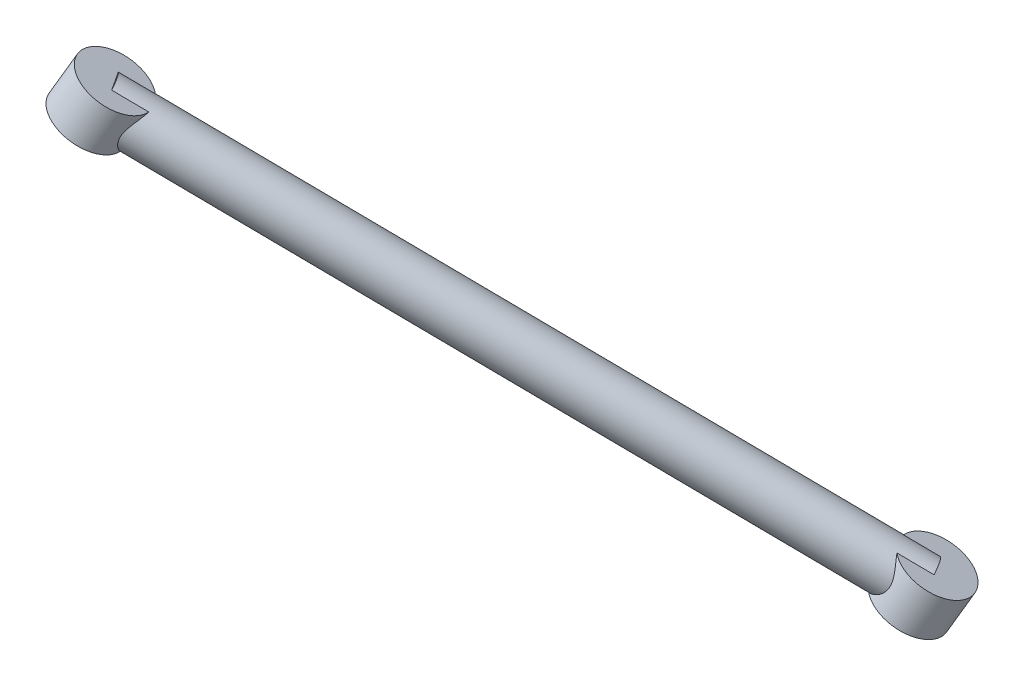
ISO-10303-21;
HEADER;
FILE_DESCRIPTION(('STEP AP214'),'2;1');
FILE_NAME('part.step','',(''),(''),'','','');
FILE_SCHEMA(('AUTOMOTIVE_DESIGN { 1 0 10303 214 1 1 1 1 }'));
ENDSEC;
DATA;
#1=APPLICATION_CONTEXT('core data for automotive mechanical design processes');
#2=APPLICATION_PROTOCOL_DEFINITION('international standard','automotive_design',2000,#1);
#3=PRODUCT_CONTEXT('',#1,'mechanical');
#4=PRODUCT('Part','Part','',(#3));
#5=PRODUCT_RELATED_PRODUCT_CATEGORY('part','',(#4));
#6=PRODUCT_DEFINITION_FORMATION('','',#4);
#7=PRODUCT_DEFINITION_CONTEXT('part definition',#1,'design');
#8=PRODUCT_DEFINITION('design','',#6,#7);
#9=PRODUCT_DEFINITION_SHAPE('','',#8);
#10=(LENGTH_UNIT() NAMED_UNIT(*) SI_UNIT(.MILLI.,.METRE.));
#11=(NAMED_UNIT(*) PLANE_ANGLE_UNIT() SI_UNIT($,.RADIAN.));
#12=(NAMED_UNIT(*) SI_UNIT($,.STERADIAN.) SOLID_ANGLE_UNIT());
#13=UNCERTAINTY_MEASURE_WITH_UNIT(LENGTH_MEASURE(1.E-05),#10,'distance_accuracy_value','');
#14=(GEOMETRIC_REPRESENTATION_CONTEXT(3) GLOBAL_UNCERTAINTY_ASSIGNED_CONTEXT((#13)) GLOBAL_UNIT_ASSIGNED_CONTEXT((#10,
#11,#12)) REPRESENTATION_CONTEXT('',''));
#15=CARTESIAN_POINT('',(0.,0.,0.));
#16=DIRECTION('',(0.,0.,1.));
#17=DIRECTION('',(1.,0.,0.));
#18=AXIS2_PLACEMENT_3D('',#15,#16,#17);
#19=CARTESIAN_POINT('',(510.46,-91.3399999999999,-282.35));
#20=DIRECTION('',(-0.73343010732889,0.486905775206921,0.474344857391413));
#21=DIRECTION('',(-0.553088880485254,-0.833122254104143,0.));
#22=AXIS2_PLACEMENT_3D('',#19,#20,#21);
#23=CYLINDRICAL_SURFACE('',#22,8.00000000000003);
#24=CARTESIAN_POINT('',(497.979704526284,-92.4944425144162,-278.757022363282));
#25=CARTESIAN_POINT('',(497.9686401532,-92.4339060738786,-279.003958226111));
#26=CARTESIAN_POINT('',(497.96842527591,-92.368060822191,-279.249942689364));
#27=CARTESIAN_POINT('',(497.987851661969,-92.2258509673458,-279.737849666615));
#28=CARTESIAN_POINT('',(498.007476064368,-92.1494953443142,-279.979775452496));
#29=CARTESIAN_POINT('',(498.064818196751,-91.9859960781895,-280.458605063477));
#30=CARTESIAN_POINT('',(498.102594244374,-91.8988183400298,-280.695490113989));
#31=CARTESIAN_POINT('',(498.19438365573,-91.7135536500882,-281.161776547205));
#32=CARTESIAN_POINT('',(498.248400627116,-91.6154642775198,-281.391176254599));
#33=CARTESIAN_POINT('',(498.370616234162,-91.4080865997483,-281.840132202242));
#34=CARTESIAN_POINT('',(498.43877496764,-91.298830234059,-282.059714069746));
#35=CARTESIAN_POINT('',(498.587475996494,-91.0679629503808,-282.487951370339));
#36=CARTESIAN_POINT('',(498.668019281134,-90.9463510457076,-282.696605928778));
#37=CARTESIAN_POINT('',(498.839389723408,-90.6896931945735,-283.100615250758));
#38=CARTESIAN_POINT('',(498.930201429063,-90.5546674695319,-283.295989307752));
#39=CARTESIAN_POINT('',(499.119954523892,-90.2696696627253,-283.671080884745));
#40=CARTESIAN_POINT('',(499.218892100208,-90.1197045839182,-283.850805667128));
#41=CARTESIAN_POINT('',(499.459289594562,-89.7459081346898,-284.253073352077));
#42=CARTESIAN_POINT('',(499.603236954973,-89.5149183431614,-284.467743600787));
#43=CARTESIAN_POINT('',(499.821252164908,-89.144005256336,-284.755884073674));
#44=CARTESIAN_POINT('',(499.894235404857,-89.0163670395075,-284.846249507383));
#45=CARTESIAN_POINT('',(500.039932885416,-88.7529982427993,-285.014487029));
#46=CARTESIAN_POINT('',(500.112647244156,-88.6172718199945,-285.092365460139));
#47=CARTESIAN_POINT('',(500.257440631761,-88.3369970303165,-285.23505006606));
#48=CARTESIAN_POINT('',(500.329508906747,-88.1923831362872,-285.299738732355));
#49=CARTESIAN_POINT('',(500.471470525285,-87.8963568495955,-285.414261462306));
#50=CARTESIAN_POINT('',(500.541363912925,-87.7449445948956,-285.464095827251));
#51=CARTESIAN_POINT('',(500.678338313978,-87.4366180268196,-285.548435523254));
#52=CARTESIAN_POINT('',(500.74541834873,-87.2797018331177,-285.582935559472));
#53=CARTESIAN_POINT('',(500.876405475152,-86.9619894698657,-285.636614553055));
#54=CARTESIAN_POINT('',(500.94031253945,-86.8011932668627,-285.655793378275));
#55=CARTESIAN_POINT('',(501.058760131645,-86.4934350354106,-285.678160182097));
#56=CARTESIAN_POINT('',(501.113600323982,-86.3466863127509,-285.682747954535));
#57=CARTESIAN_POINT('',(501.220932322712,-86.0523990932229,-285.680507337097));
#58=CARTESIAN_POINT('',(501.273423276173,-85.9048603309376,-285.673674834859));
#59=CARTESIAN_POINT('',(501.42792657737,-85.4623646899532,-285.637076461534));
#60=CARTESIAN_POINT('',(501.526946696968,-85.1675888127945,-285.591205938089));
#61=CARTESIAN_POINT('',(501.69988312355,-84.6469164414158,-285.476200309172));
#62=CARTESIAN_POINT('',(501.774670602433,-84.4196675074609,-285.414060104468));
#63=CARTESIAN_POINT('',(501.923398302998,-83.9713463500511,-285.269364641217));
#64=CARTESIAN_POINT('',(501.997338125305,-83.7502769728136,-285.186800142509));
#65=CARTESIAN_POINT('',(502.146183749991,-83.3158805107332,-285.003226099497));
#66=CARTESIAN_POINT('',(502.221090857817,-83.102565795724,-284.902188513233));
#67=CARTESIAN_POINT('',(502.373335161067,-82.6856063790795,-284.683433896029));
#68=CARTESIAN_POINT('',(502.450672127916,-82.4819607723746,-284.565718430335));
#69=CARTESIAN_POINT('',(502.607657105387,-82.0896385092538,-284.317320022102));
#70=CARTESIAN_POINT('',(502.687233931976,-81.9007518511049,-284.186923813876));
#71=CARTESIAN_POINT('',(502.85114303619,-81.5354141974547,-283.912483659537));
#72=CARTESIAN_POINT('',(502.935474304785,-81.3589605810579,-283.768442604868));
#73=CARTESIAN_POINT('',(503.109624433282,-81.020609669561,-283.46806691869));
#74=CARTESIAN_POINT('',(503.199429031101,-80.8586770493904,-283.311763956692));
#75=CARTESIAN_POINT('',(503.38545153918,-80.5507029313751,-282.987486684167));
#76=CARTESIAN_POINT('',(503.481674394108,-80.404673919198,-282.819503370695));
#77=CARTESIAN_POINT('',(503.581405175729,-80.2676399121447,-282.646270580201));
#78=B_SPLINE_CURVE_WITH_KNOTS('',3,(#24,#25,#26,#27,#28,#29,#30,#31,#32,#33,#34,#35,#36,#37,#38,
#39,#40,#41,#42,#43,#44,#45,#46,#47,#48,#49,#50,#51,#52,#53,#54,#55,#56,#57,#58,#59,#60,#61,#62,
#63,#64,#65,#66,#67,#68,#69,#70,#71,#72,#73,#74,#75,#76,#77),.UNSPECIFIED.,.F.,.F.,(4,2,2,2,2,2,
2,2,2,2,2,2,2,2,2,2,2,2,2,2,2,2,2,2,2,2,4),(0.,0.762988254942127,1.5253286083267,
2.29013475509866,3.05511091661943,3.81795729148071,4.58086463341728,5.34263885412003,
6.10405765165901,7.13954188038951,7.65675990399524,8.17371434952882,8.69509046337565,
9.21645600145778,9.73800142393714,10.2595513447312,10.7292678807946,11.1991535950392,
12.139117010572,12.8797816748248,13.620782038188,14.3629167152051,15.1049817877569,
15.8330388812543,16.5609420376944,17.2870234611222,18.0136708715011),.UNSPECIFIED.);
#79=CARTESIAN_POINT('',(497.979704526284,-92.4944425144162,-278.757022363282));
#80=VERTEX_POINT('',#79);
#81=CARTESIAN_POINT('',(503.581405175729,-80.2676399121447,-282.646270580201));
#82=VERTEX_POINT('',#81);
#83=EDGE_CURVE('E234',#80,#82,#78,.T.);
#84=ORIENTED_EDGE('',*,*,#83,.F.);
#85=CARTESIAN_POINT('',(497.577872162434,-92.227675233185,-278.497142146136));
#86=CARTESIAN_POINT('',(499.109320605838,-93.2443686962289,-279.487587888538));
#87=CARTESIAN_POINT('',(500.640769049243,-94.2610621592728,-280.478033630939));
#88=CARTESIAN_POINT('',(503.703665936053,-96.2944490853605,-282.458925115742));
#89=CARTESIAN_POINT('',(505.235114379458,-97.3111425484044,-283.449370858143));
#90=CARTESIAN_POINT('',(506.766562822862,-98.3278360114483,-284.439816600544));
#91=B_SPLINE_CURVE_WITH_KNOTS('',3,(#85,#86,#87,#88,#89,#90),.UNSPECIFIED.,.F.,.F.,(4,2,4),(0.,
6.26417147843166,12.5283429568634),.UNSPECIFIED.);
#92=CARTESIAN_POINT('',(505.530851654179,-97.5074757356939,-283.640635360788));
#93=VERTEX_POINT('',#92);
#94=EDGE_CURVE('E145',#80,#93,#91,.T.);
#95=ORIENTED_EDGE('',*,*,#94,.T.);
#96=CARTESIAN_POINT('',(510.46,-91.3399999999999,-282.35));
#97=DIRECTION('',(-0.73343010732889,0.486905775206922,0.474344857391413));
#98=DIRECTION('',(-0.553088880485254,-0.833122254104143,0.));
#99=AXIS2_PLACEMENT_3D('',#96,#97,#98);
#100=CIRCLE('',#99,8.00000000000003);
#101=CARTESIAN_POINT('',(509.787521298611,-97.3993249965391,-277.170004538371));
#102=VERTEX_POINT('',#101);
#103=EDGE_CURVE('E208',#93,#102,#100,.T.);
#104=ORIENTED_EDGE('',*,*,#103,.T.);
#105=CARTESIAN_POINT('',(511.186126099011,-98.3278360114483,-278.074564802387));
#106=CARTESIAN_POINT('',(509.621382400846,-97.2890280803215,-277.062552708586));
#107=CARTESIAN_POINT('',(508.056638702681,-96.2502201491946,-276.050540614785));
#108=CARTESIAN_POINT('',(504.927151306351,-94.1726042869409,-274.026516427184));
#109=CARTESIAN_POINT('',(503.362407608186,-93.1337963558141,-273.014504333383));
#110=CARTESIAN_POINT('',(501.797663910021,-92.0949884246873,-272.002492239582));
#111=B_SPLINE_CURVE_WITH_KNOTS('',3,(#105,#106,#107,#108,#109,#110),.UNSPECIFIED.,.F.,.F.,(4,2,
4),(0.,6.40042335556511,12.8008467111302),.UNSPECIFIED.);
#112=CARTESIAN_POINT('',(502.23644777212,-92.3862899052442,-272.286279658207));
#113=VERTEX_POINT('',#112);
#114=EDGE_CURVE('E240',#102,#113,#111,.T.);
#115=ORIENTED_EDGE('',*,*,#114,.T.);
#116=CARTESIAN_POINT('',(507.838001217095,-80.1594910430497,-276.175751642969));
#117=CARTESIAN_POINT('',(507.965743005422,-80.2974809999335,-276.004275179449));
#118=CARTESIAN_POINT('',(508.089854139774,-80.4455721704037,-275.838418617055));
#119=CARTESIAN_POINT('',(508.329243212757,-80.7595917073239,-275.517896053448));
#120=CARTESIAN_POINT('',(508.444528563169,-80.9255048193528,-275.363220668648));
#121=CARTESIAN_POINT('',(508.665272390828,-81.2736067762697,-275.064238078523));
#122=CARTESIAN_POINT('',(508.770697891968,-81.455846507623,-274.919966011125));
#123=CARTESIAN_POINT('',(508.969782100656,-81.834202935314,-274.641796421601));
#124=CARTESIAN_POINT('',(509.063438187127,-82.0303227076239,-274.507901212963));
#125=CARTESIAN_POINT('',(509.23697885813,-82.434033281062,-274.250219181376));
#126=CARTESIAN_POINT('',(509.316901062418,-82.6415906212981,-274.126405250364));
#127=CARTESIAN_POINT('',(509.461258874376,-83.0669995712791,-273.887696477532));
#128=CARTESIAN_POINT('',(509.525693244139,-83.2848520022222,-273.772802349149));
#129=CARTESIAN_POINT('',(509.636493982771,-83.7288230226527,-273.551278885355));
#130=CARTESIAN_POINT('',(509.682887034467,-83.954928859503,-273.444637532782));
#131=CARTESIAN_POINT('',(509.754721966404,-84.4135747258398,-273.238718443064));
#132=CARTESIAN_POINT('',(509.780173610399,-84.6461117045284,-273.139437293957));
#133=CARTESIAN_POINT('',(509.811341205431,-85.2001844426889,-272.912787769999));
#134=CARTESIAN_POINT('',(509.806654722012,-85.5236249242804,-272.788173749902));
#135=CARTESIAN_POINT('',(509.758773012532,-86.0074851367934,-272.610051624547));
#136=CARTESIAN_POINT('',(509.73602564288,-86.1684738442059,-272.552171181658));
#137=CARTESIAN_POINT('',(509.676037659692,-86.4887438824896,-272.439356414238));
#138=CARTESIAN_POINT('',(509.638804438175,-86.6480260416699,-272.384420603326));
#139=CARTESIAN_POINT('',(509.548892908442,-86.9647377281813,-272.27722148281));
#140=CARTESIAN_POINT('',(509.49608520134,-87.1221397514222,-272.224985054951));
#141=CARTESIAN_POINT('',(509.375112799959,-87.4321039109604,-272.124028475721));
#142=CARTESIAN_POINT('',(509.306948417345,-87.5846661454093,-272.075308253015));
#143=CARTESIAN_POINT('',(509.155810058965,-87.8835944037632,-271.981800351553));
#144=CARTESIAN_POINT('',(509.072830984545,-88.0299582729015,-271.937014034641));
#145=CARTESIAN_POINT('',(508.893199900965,-88.3153828642895,-271.851867970381));
#146=CARTESIAN_POINT('',(508.79654777405,-88.4544435236283,-271.811508261161));
#147=CARTESIAN_POINT('',(508.601288373525,-88.7112110694527,-271.739457757339));
#148=CARTESIAN_POINT('',(508.503830399751,-88.8296665514513,-271.707304041067));
#149=CARTESIAN_POINT('',(508.300228688569,-89.0600421847956,-271.647276523042));
#150=CARTESIAN_POINT('',(508.194081835461,-89.1719599669523,-271.619404266952));
#151=CARTESIAN_POINT('',(507.864298911102,-89.498091569256,-271.542632260418));
#152=CARTESIAN_POINT('',(507.6293592315,-89.7026339631355,-271.500591462412));
#153=CARTESIAN_POINT('',(507.19058377667,-90.0468209725604,-271.44365566275));
#154=CARTESIAN_POINT('',(506.990715413697,-90.1910302272983,-271.424894919577));
#155=CARTESIAN_POINT('',(506.58112090013,-90.4661654781132,-271.400864815131));
#156=CARTESIAN_POINT('',(506.371390322632,-90.597085424035,-271.395601572574));
#157=CARTESIAN_POINT('',(505.944697759512,-90.8470238808429,-271.399467767367));
#158=CARTESIAN_POINT('',(505.727725194424,-90.9660238641731,-271.408619251764));
#159=CARTESIAN_POINT('',(505.289265026696,-91.192969989388,-271.442252989293));
#160=CARTESIAN_POINT('',(505.067777849398,-91.3009171668906,-271.466733804577));
#161=CARTESIAN_POINT('',(504.626643994425,-91.5046021806463,-271.531349975796));
#162=CARTESIAN_POINT('',(504.407041418168,-91.6005319262016,-271.571181302074));
#163=CARTESIAN_POINT('',(503.967582248676,-91.7829443714903,-271.667403207793));
#164=CARTESIAN_POINT('',(503.747725718961,-91.86942906419,-271.723790284565));
#165=CARTESIAN_POINT('',(503.310271145234,-92.0329846950671,-271.853867914397));
#166=CARTESIAN_POINT('',(503.092668825271,-92.1100786568843,-271.927514798027));
#167=CARTESIAN_POINT('',(502.661179021845,-92.2550996248169,-272.093030564632));
#168=CARTESIAN_POINT('',(502.447294566123,-92.323019438893,-272.184913606034));
#169=CARTESIAN_POINT('',(502.23644777212,-92.3862899052442,-272.286279658207));
#170=B_SPLINE_CURVE_WITH_KNOTS('',3,(#116,#117,#118,#119,#120,#121,#122,#123,#124,#125,#126,
#127,#128,#129,#130,#131,#132,#133,#134,#135,#136,#137,#138,#139,#140,#141,#142,#143,#144,#145,
#146,#147,#148,#149,#150,#151,#152,#153,#154,#155,#156,#157,#158,#159,#160,#161,#162,#163,#164,
#165,#166,#167,#168,#169),.UNSPECIFIED.,.F.,.F.,(4,2,2,2,2,2,2,2,2,2,2,2,2,2,2,2,2,2,2,2,2,2,2,
2,2,2,4),(0.,0.762982175315875,1.52531641437081,2.29011533983668,3.05508428723433,
3.81792322674231,4.58082311792002,5.34259036141129,6.10400223574012,7.13950341822903,
7.65672989610436,8.17369278275156,8.6950779795178,9.216452595742,9.73800699644636,
10.2595658891482,10.7292818169262,11.199166921781,12.1391291356849,12.8797876567713,
13.6207818754047,14.3629105313427,15.1049695880797,15.8330299552624,16.5609363990318,
17.2870206628007,18.0136708743375),.UNSPECIFIED.);
#171=CARTESIAN_POINT('',(507.838001217095,-80.1594910430497,-276.175751642969));
#172=VERTEX_POINT('',#171);
#173=EDGE_CURVE('E132',#172,#113,#170,.T.);
#174=ORIENTED_EDGE('',*,*,#173,.F.);
#175=CARTESIAN_POINT('',(515.898318955159,-85.5105509424443,-281.388664567179));
#176=CARTESIAN_POINT('',(514.481806971051,-84.5701611561515,-280.472552588825));
#177=CARTESIAN_POINT('',(513.065294986942,-83.6297713698586,-279.556440610471));
#178=CARTESIAN_POINT('',(510.232271018724,-81.7489917972729,-277.724216653763));
#179=CARTESIAN_POINT('',(508.815759034615,-80.8086020109801,-276.808104675409));
#180=CARTESIAN_POINT('',(507.399247050507,-79.8682122246873,-275.891992697055));
#181=B_SPLINE_CURVE_WITH_KNOTS('',3,(#175,#176,#177,#178,#179,#180),.UNSPECIFIED.,.F.,.F.,(4,2,
4),(0.,5.794040280628,11.5880805612561),.UNSPECIFIED.);
#182=CARTESIAN_POINT('',(515.389148345821,-85.172524264306,-281.059364639211));
#183=VERTEX_POINT('',#182);
#184=EDGE_CURVE('E219',#183,#172,#181,.T.);
#185=ORIENTED_EDGE('',*,*,#184,.F.);
#186=CARTESIAN_POINT('',(511.132478701389,-85.2806750034608,-287.529995461629));
#187=VERTEX_POINT('',#186);
#188=EDGE_CURVE('E210',#183,#187,#100,.T.);
#189=ORIENTED_EDGE('',*,*,#188,.T.);
#190=CARTESIAN_POINT('',(503.179536162434,-80.0008456001787,-282.386358172645));
#191=CARTESIAN_POINT('',(504.985091392909,-81.1995243971409,-283.554117296346));
#192=CARTESIAN_POINT('',(506.790646623384,-82.3982031941031,-284.721876420048));
#193=CARTESIAN_POINT('',(510.401757084334,-84.7955607880275,-287.057394667451));
#194=CARTESIAN_POINT('',(512.207312314809,-85.9942395849897,-288.225153791152));
#195=CARTESIAN_POINT('',(514.012867545284,-87.1929183819519,-289.392912914853));
#196=B_SPLINE_CURVE_WITH_KNOTS('',3,(#190,#191,#192,#193,#194,#195),.UNSPECIFIED.,.F.,.F.,(4,2,
4),(0.,7.38543819120674,14.7708763824135),.UNSPECIFIED.);
#197=EDGE_CURVE('E148',#82,#187,#196,.T.);
#198=ORIENTED_EDGE('',*,*,#197,.F.);
#199=EDGE_LOOP('',(#84,#95,#104,#115,#174,#185,#189,#198));
#200=FACE_BOUND('',#199,.T.);
#201=CARTESIAN_POINT('',(349.934894824271,8.72273991214472,-173.785629419799));
#202=CARTESIAN_POINT('',(350.039622800354,8.86663631208198,-173.603724919202));
#203=CARTESIAN_POINT('',(350.140473905696,9.02044317922038,-173.427612824492));
#204=CARTESIAN_POINT('',(350.335126386601,9.34549056626705,-173.088341960043));
#205=CARTESIAN_POINT('',(350.428933676174,9.51671617032739,-172.925172317147));
#206=CARTESIAN_POINT('',(350.610671046292,9.87504411203316,-172.612336875497));
#207=CARTESIAN_POINT('',(350.698581144811,10.0621959906177,-172.46271644131));
#208=CARTESIAN_POINT('',(350.869323356151,10.4499487313952,-172.178707042968));
#209=CARTESIAN_POINT('',(350.952154335744,10.6505525741734,-172.044321472306));
#210=CARTESIAN_POINT('',(351.113813508865,11.0627796908096,-171.792460921491));
#211=CARTESIAN_POINT('',(351.192652205703,11.2743707264555,-171.674939896767));
#212=CARTESIAN_POINT('',(351.348115998807,11.7073973519694,-171.457885107708));
#213=CARTESIAN_POINT('',(351.4247409177,11.9288337270771,-171.358352781325));
#214=CARTESIAN_POINT('',(351.57743129555,12.3794993612288,-171.179339233286));
#215=CARTESIAN_POINT('',(351.653497416216,12.6087165623882,-171.09982846193));
#216=CARTESIAN_POINT('',(351.807067499977,13.0730893751627,-170.96310582374));
#217=CARTESIAN_POINT('',(351.884570775755,13.3082421665883,-170.905883571632));
#218=CARTESIAN_POINT('',(352.071814641217,13.8678641634099,-170.800522381513));
#219=CARTESIAN_POINT('',(352.183116826318,14.1940134685432,-170.763068187938));
#220=CARTESIAN_POINT('',(352.358190110761,14.681105283223,-170.747844389355));
#221=CARTESIAN_POINT('',(352.417868900793,14.8430323205381,-170.749584796256));
#222=CARTESIAN_POINT('',(352.540287509535,15.1648885562163,-170.767497782773));
#223=CARTESIAN_POINT('',(352.60302575277,15.3248187306718,-170.78366300695));
#224=CARTESIAN_POINT('',(352.732193661772,15.6425278181538,-170.831187884713));
#225=CARTESIAN_POINT('',(352.798650314415,15.8002766250711,-170.862676334672));
#226=CARTESIAN_POINT('',(352.934491313667,16.1106185564319,-170.941030923213));
#227=CARTESIAN_POINT('',(353.003875600836,16.2632117854354,-170.98789674972));
#228=CARTESIAN_POINT('',(353.144993720654,16.5618854559782,-171.096636574234));
#229=CARTESIAN_POINT('',(353.216728355242,16.7079636335829,-171.158515741904));
#230=CARTESIAN_POINT('',(353.361660440154,16.9925066150111,-171.296408302614));
#231=CARTESIAN_POINT('',(353.434857903072,17.130971353252,-171.372421817382));
#232=CARTESIAN_POINT('',(353.574395770255,17.3863231620047,-171.529175504968));
#233=CARTESIAN_POINT('',(353.640694548703,17.5039869711023,-171.608694806667));
#234=CARTESIAN_POINT('',(353.772902738045,17.7325486835172,-171.777248745941));
#235=CARTESIAN_POINT('',(353.838812000099,17.843444134702,-171.866286800328));
#236=CARTESIAN_POINT('',(354.034895047371,18.1661787760622,-172.146298103753));
#237=CARTESIAN_POINT('',(354.163396478812,18.3680168550254,-172.350137365527));
#238=CARTESIAN_POINT('',(354.384154424615,18.706664615056,-172.738485027412));
#239=CARTESIAN_POINT('',(354.47831887772,18.8481882124751,-172.917927955106));
#240=CARTESIAN_POINT('',(354.658368964863,19.1174913453527,-173.290892171146));
#241=CARTESIAN_POINT('',(354.744250827248,19.2452646223521,-173.484419803535));
#242=CARTESIAN_POINT('',(354.90584692339,19.4884676777204,-173.883530939245));
#243=CARTESIAN_POINT('',(354.981545389553,19.6038782591242,-174.089132446098));
#244=CARTESIAN_POINT('',(355.12082466484,19.8232229876226,-174.510288313077));
#245=CARTESIAN_POINT('',(355.18440660973,19.9271582099989,-174.725841737983));
#246=CARTESIAN_POINT('',(355.296656361176,20.1224871468532,-175.161167492037));
#247=CARTESIAN_POINT('',(355.345582890592,20.214080464599,-175.380783522867));
#248=CARTESIAN_POINT('',(355.428478277573,20.3874335654105,-175.826579860047));
#249=CARTESIAN_POINT('',(355.462450295237,20.4691954233462,-176.052758768789));
#250=CARTESIAN_POINT('',(355.513757853258,20.6229400778827,-176.509669322332));
#251=CARTESIAN_POINT('',(355.531134827088,20.694946842198,-176.740388152825));
#252=CARTESIAN_POINT('',(355.547828451874,20.8294289341864,-177.205410615101));
#253=CARTESIAN_POINT('',(355.547131015118,20.8918967888155,-177.439716900892));
#254=CARTESIAN_POINT('',(355.536595473716,20.9495425144162,-177.674877636717));
#255=B_SPLINE_CURVE_WITH_KNOTS('',3,(#201,#202,#203,#204,#205,#206,#207,#208,#209,#210,#211,
#212,#213,#214,#215,#216,#217,#218,#219,#220,#221,#222,#223,#224,#225,#226,#227,#228,#229,#230,
#231,#232,#233,#234,#235,#236,#237,#238,#239,#240,#241,#242,#243,#244,#245,#246,#247,#248,#249,
#250,#251,#252,#253,#254),.UNSPECIFIED.,.F.,.F.,(4,2,2,2,2,2,2,2,2,2,2,2,2,2,2,2,2,2,2,2,2,2,2,
2,2,2,4),(0.,0.762982175315764,1.52531641437072,2.29011533983666,3.05508428723433,
3.81792322674234,4.58082311792002,5.3425903614113,6.1040022357401,7.139503418229,
7.65672989610434,8.17369278275157,8.69507797951785,9.21645259574207,9.73800699644641,
10.2595658891482,10.7292818169262,11.199166921781,12.139129135685,12.8797876567712,
13.6207818754046,14.3629105313426,15.1049695880797,15.8330299552624,16.5609363990317,
17.2870206628005,18.0136708743374),.UNSPECIFIED.);
#256=CARTESIAN_POINT('',(349.934894824271,8.72273991214472,-173.785629419799));
#257=VERTEX_POINT('',#256);
#258=CARTESIAN_POINT('',(355.536595473716,20.9495425144162,-177.674877636717));
#259=VERTEX_POINT('',#258);
#260=EDGE_CURVE('E12',#257,#259,#255,.T.);
#261=ORIENTED_EDGE('',*,*,#260,.F.);
#262=CARTESIAN_POINT('',(350.336763837566,8.45594560017856,-174.045541827355));
#263=CARTESIAN_POINT('',(348.531208607091,9.65462439714079,-172.877782703654));
#264=CARTESIAN_POINT('',(346.725653376616,10.853303194103,-171.710023579952));
#265=CARTESIAN_POINT('',(343.114542915666,13.2506607880274,-169.374505332549));
#266=CARTESIAN_POINT('',(341.308987685191,14.4493395849897,-168.206746208848));
#267=CARTESIAN_POINT('',(339.503432454716,15.6480183819519,-167.038987085146));
#268=B_SPLINE_CURVE_WITH_KNOTS('',3,(#262,#263,#264,#265,#266,#267),.UNSPECIFIED.,.F.,.F.,(4,2,
4),(0.,7.38543819120676,14.7708763824136),.UNSPECIFIED.);
#269=CARTESIAN_POINT('',(342.383821298611,13.7357750034609,-168.901904538371));
#270=VERTEX_POINT('',#269);
#271=EDGE_CURVE('E191',#257,#270,#268,.T.);
#272=ORIENTED_EDGE('',*,*,#271,.T.);
#273=CARTESIAN_POINT('',(343.0563,19.7951000000001,-174.0819));
#274=DIRECTION('',(-0.73343010732889,0.486905775206922,0.474344857391413));
#275=DIRECTION('',(-0.553088880485254,-0.833122254104143,0.));
#276=AXIS2_PLACEMENT_3D('',#273,#274,#275);
#277=CIRCLE('',#276,8.00000000000003);
#278=CARTESIAN_POINT('',(338.127151654179,13.6276242643062,-175.372535360789));
#279=VERTEX_POINT('',#278);
#280=EDGE_CURVE('E133',#279,#270,#277,.T.);
#281=ORIENTED_EDGE('',*,*,#280,.F.);
#282=CARTESIAN_POINT('',(337.61798104484,13.9656509424446,-175.043235432821));
#283=CARTESIAN_POINT('',(339.034493028949,13.0252611561517,-175.959347411175));
#284=CARTESIAN_POINT('',(340.451005013058,12.0848713698588,-176.875459389529));
#285=CARTESIAN_POINT('',(343.284028981276,10.204091797273,-178.707683346237));
#286=CARTESIAN_POINT('',(344.700540965384,9.26370201098013,-179.623795324591));
#287=CARTESIAN_POINT('',(346.117052949493,8.32331222468724,-180.539907302945));
#288=B_SPLINE_CURVE_WITH_KNOTS('',3,(#282,#283,#284,#285,#286,#287),.UNSPECIFIED.,.F.,.F.,(4,2,
4),(0.,5.79404028062824,11.5880805612565),.UNSPECIFIED.);
#289=CARTESIAN_POINT('',(345.678298782906,8.61459104304961,-180.256148357031));
#290=VERTEX_POINT('',#289);
#291=EDGE_CURVE('E141',#279,#290,#288,.T.);
#292=ORIENTED_EDGE('',*,*,#291,.T.);
#293=CARTESIAN_POINT('',(351.27985222788,20.8413899052441,-184.145620341793));
#294=CARTESIAN_POINT('',(351.05844834648,20.7749470600163,-184.252063147818));
#295=CARTESIAN_POINT('',(350.833702745564,20.7033861564151,-184.348044664003));
#296=CARTESIAN_POINT('',(350.380238752655,20.5501485517273,-184.519925114853));
#297=CARTESIAN_POINT('',(350.151523896268,20.4684804922047,-184.595841033698));
#298=CARTESIAN_POINT('',(349.691705031458,20.2947553547438,-184.728822666645));
#299=CARTESIAN_POINT('',(349.460595688132,20.2026655278903,-184.785826615438));
#300=CARTESIAN_POINT('',(348.998984857999,20.0080046519308,-184.881711567605));
#301=CARTESIAN_POINT('',(348.768483517739,19.9054312774225,-184.92058853947));
#302=CARTESIAN_POINT('',(348.31107378844,19.6895372018307,-184.981166476325));
#303=CARTESIAN_POINT('',(348.08415718288,19.5762472176916,-185.002914960058));
#304=CARTESIAN_POINT('',(347.635641035171,19.3377624232779,-185.03043136157));
#305=CARTESIAN_POINT('',(347.414041919415,19.2125666622871,-185.036198002036));
#306=CARTESIAN_POINT('',(346.979187855796,18.9492143878634,-185.032714298413));
#307=CARTESIAN_POINT('',(346.765921003466,18.8110774007948,-185.023486245836));
#308=CARTESIAN_POINT('',(346.350771539147,18.5203528672278,-184.991023253514));
#309=CARTESIAN_POINT('',(346.148883662006,18.367772093039,-184.967794851011));
#310=CARTESIAN_POINT('',(345.690089686819,17.9884267657429,-184.897515109321));
#311=CARTESIAN_POINT('',(345.439536319811,17.7547283969993,-184.844898336629));
#312=CARTESIAN_POINT('',(345.094343536688,17.3805840637552,-184.75008250336));
#313=CARTESIAN_POINT('',(344.984433451014,17.2520076332541,-184.715850151635));
#314=CARTESIAN_POINT('',(344.776314272953,16.9870528659896,-184.642500839247));
#315=CARTESIAN_POINT('',(344.678099246199,16.8506785385257,-184.603386376708));
#316=CARTESIAN_POINT('',(344.494057962229,16.5694065634055,-184.520363118543));
#317=CARTESIAN_POINT('',(344.408344855234,16.4244459902137,-184.476416177106));
#318=CARTESIAN_POINT('',(344.251522473834,16.1280421307662,-184.384483527722));
#319=CARTESIAN_POINT('',(344.180412903236,15.9765989760677,-184.336497901717));
#320=CARTESIAN_POINT('',(344.053465724489,15.6685271732413,-184.236915666561));
#321=CARTESIAN_POINT('',(343.997633394021,15.5118967540141,-184.185317817241));
#322=CARTESIAN_POINT('',(343.901351294844,15.1950661538921,-184.078883163073));
#323=CARTESIAN_POINT('',(343.860901658813,15.0348659422198,-184.024046330293));
#324=CARTESIAN_POINT('',(343.798180859513,14.7285235814708,-183.916968347577));
#325=CARTESIAN_POINT('',(343.774502581685,14.5825666007993,-183.86501085624));
#326=CARTESIAN_POINT('',(343.738569473761,14.290093438612,-183.75871689098));
#327=CARTESIAN_POINT('',(343.726318761128,14.1435770746223,-183.704379566958));
#328=CARTESIAN_POINT('',(343.705523180622,13.7044785938668,-183.537726720206));
#329=CARTESIAN_POINT('',(343.71294639718,13.4124071608969,-183.421791045541));
#330=CARTESIAN_POINT('',(343.758037072443,12.8972742826408,-183.205370230039));
#331=CARTESIAN_POINT('',(343.788958181108,12.6727111248521,-183.106821139608));
#332=CARTESIAN_POINT('',(343.8697844417,12.2302223276319,-182.902567997367));
#333=CARTESIAN_POINT('',(343.919698191609,12.0122997427229,-182.796860722884));
#334=CARTESIAN_POINT('',(344.035958935297,11.5846389336506,-182.577442384124));
#335=CARTESIAN_POINT('',(344.102330967909,11.3749137486593,-182.463719315453));
#336=CARTESIAN_POINT('',(344.24927785338,10.9655559903326,-182.227668676613));
#337=CARTESIAN_POINT('',(344.329851373579,10.7659224722607,-182.105341914456));
#338=CARTESIAN_POINT('',(344.501759064627,10.3819565036551,-181.853785377637));
#339=CARTESIAN_POINT('',(344.592861394703,10.1974063523282,-181.724729501459));
#340=CARTESIAN_POINT('',(344.785522087781,9.84112819597482,-181.457142269737));
#341=CARTESIAN_POINT('',(344.887078235934,9.66939748814275,-181.318612923416));
#342=CARTESIAN_POINT('',(345.099080806074,9.34085769737465,-181.031991787506));
#343=CARTESIAN_POINT('',(345.209504342148,9.18401234553556,-180.883924797663));
#344=CARTESIAN_POINT('',(345.438283321123,8.8865772383374,-180.577655771902));
#345=CARTESIAN_POINT('',(345.556644879919,8.7460002496655,-180.419445925595));
#346=CARTESIAN_POINT('',(345.678298782906,8.61459104304959,-180.256148357031));
#347=B_SPLINE_CURVE_WITH_KNOTS('',3,(#293,#294,#295,#296,#297,#298,#299,#300,#301,#302,#303,
#304,#305,#306,#307,#308,#309,#310,#311,#312,#313,#314,#315,#316,#317,#318,#319,#320,#321,#322,
#323,#324,#325,#326,#327,#328,#329,#330,#331,#332,#333,#334,#335,#336,#337,#338,#339,#340,#341,
#342,#343,#344,#345,#346),.UNSPECIFIED.,.F.,.F.,(4,2,2,2,2,2,2,2,2,2,2,2,2,2,2,2,2,2,2,2,2,2,2,
2,2,2,4),(0.,0.762988254942136,1.52532860832674,2.2901347550988,3.05511091661951,
3.81795729148064,4.58086463341735,5.34263885412015,6.10405765165917,7.13954188038967,
7.65675990399541,8.17371434952904,8.69509046337576,9.21645600145792,9.73800142393724,
10.2595513447314,10.7292678807949,11.1991535950393,12.1391170105721,12.8797816748249,
13.6207820381882,14.3629167152052,15.104981787757,15.8330388812544,16.5609420376945,
17.2870234611223,18.0136708715012),.UNSPECIFIED.);
#348=CARTESIAN_POINT('',(351.27985222788,20.8413899052441,-184.145620341793));
#349=VERTEX_POINT('',#348);
#350=EDGE_CURVE('E75',#349,#290,#347,.T.);
#351=ORIENTED_EDGE('',*,*,#350,.F.);
#352=CARTESIAN_POINT('',(342.330173900989,26.7829360114484,-178.357335197613));
#353=CARTESIAN_POINT('',(343.894917599154,25.7441280803215,-179.369347291414));
#354=CARTESIAN_POINT('',(345.459661297319,24.7053201491947,-180.381359385214));
#355=CARTESIAN_POINT('',(348.589148693649,22.6277042869409,-182.405383572816));
#356=CARTESIAN_POINT('',(350.153892391814,21.5888963558141,-183.417395666617));
#357=CARTESIAN_POINT('',(351.718636089979,20.5500884246872,-184.429407760418));
#358=B_SPLINE_CURVE_WITH_KNOTS('',3,(#352,#353,#354,#355,#356,#357),.UNSPECIFIED.,.F.,.F.,(4,2,
4),(0.,6.40042335556522,12.8008467111304),.UNSPECIFIED.);
#359=CARTESIAN_POINT('',(343.728778701389,25.8544249965392,-179.261895461629));
#360=VERTEX_POINT('',#359);
#361=EDGE_CURVE('E136',#360,#349,#358,.T.);
#362=ORIENTED_EDGE('',*,*,#361,.F.);
#363=CARTESIAN_POINT('',(347.985448345821,25.962575735694,-172.791264639211));
#364=VERTEX_POINT('',#363);
#365=EDGE_CURVE('E127',#364,#360,#277,.T.);
#366=ORIENTED_EDGE('',*,*,#365,.F.);
#367=CARTESIAN_POINT('',(355.938427837566,20.6827752331851,-177.934757853863));
#368=CARTESIAN_POINT('',(354.406979394162,21.6994686962289,-176.944312111462));
#369=CARTESIAN_POINT('',(352.875530950757,22.7161621592728,-175.953866369061));
#370=CARTESIAN_POINT('',(349.812634063947,24.7495490853606,-173.972974884258));
#371=CARTESIAN_POINT('',(348.281185620542,25.7662425484045,-172.982529141857));
#372=CARTESIAN_POINT('',(346.749737177137,26.7829360114484,-171.992083399455));
#373=B_SPLINE_CURVE_WITH_KNOTS('',3,(#367,#368,#369,#370,#371,#372),.UNSPECIFIED.,.F.,.F.,(4,2,
4),(0.,6.26417147843171,12.5283429568634),.UNSPECIFIED.);
#374=EDGE_CURVE('E82',#259,#364,#373,.T.);
#375=ORIENTED_EDGE('',*,*,#374,.F.);
#376=EDGE_LOOP('',(#261,#272,#281,#292,#351,#362,#366,#375));
#377=FACE_BOUND('',#376,.T.);
#378=ADVANCED_FACE('F61',(#200,#377),#23,.T.);
#379=CARTESIAN_POINT('',(343.0563,19.7951000000001,-174.0819));
#380=DIRECTION('',(-0.73343010732889,0.486905775206922,0.474344857391413));
#381=DIRECTION('',(-0.553088880485254,-0.833122254104143,0.));
#382=AXIS2_PLACEMENT_3D('',#379,#380,#381);
#383=PLANE('',#382);
#384=ORIENTED_EDGE('',*,*,#280,.T.);
#385=DIRECTION('',(-0.549533705122583,-0.0139622008198792,-0.835354873022544));
#386=VECTOR('',#385,1.);
#387=CARTESIAN_POINT('',(340.255486476395,13.6816996338835,-172.13721994958));
#388=LINE('',#387,#386);
#389=EDGE_CURVE('E144',#270,#279,#388,.T.);
#390=ORIENTED_EDGE('',*,*,#389,.T.);
#391=EDGE_LOOP('',(#384,#390));
#392=FACE_BOUND('',#391,.T.);
#393=ADVANCED_FACE('F265',(#392),#383,.T.);
#394=CARTESIAN_POINT('',(510.46,-91.3399999999999,-282.35));
#395=DIRECTION('',(-0.73343010732889,0.486905775206922,0.474344857391413));
#396=DIRECTION('',(-0.553088880485254,-0.833122254104143,0.));
#397=AXIS2_PLACEMENT_3D('',#394,#395,#396);
#398=PLANE('',#397);
#399=DIRECTION('',(-0.549533705122586,-0.0139622008198849,-0.835354873022543));
#400=VECTOR('',#399,1.);
#401=CARTESIAN_POINT('',(507.659186476395,-97.4534003661165,-280.40531994958));
#402=LINE('',#401,#400);
#403=EDGE_CURVE('E205',#102,#93,#402,.T.);
#404=ORIENTED_EDGE('',*,*,#403,.F.);
#405=ORIENTED_EDGE('',*,*,#103,.F.);
#406=EDGE_LOOP('',(#404,#405));
#407=FACE_BOUND('',#406,.T.);
#408=ADVANCED_FACE('F263',(#407),#398,.F.);
#409=ORIENTED_EDGE('',*,*,#188,.F.);
#410=DIRECTION('',(-0.549533705122586,-0.0139622008198849,-0.835354873022543));
#411=VECTOR('',#410,1.);
#412=CARTESIAN_POINT('',(513.260813523605,-85.2265996338834,-284.29468005042));
#413=LINE('',#412,#411);
#414=EDGE_CURVE('E203',#183,#187,#413,.T.);
#415=ORIENTED_EDGE('',*,*,#414,.T.);
#416=EDGE_LOOP('',(#409,#415));
#417=FACE_BOUND('',#416,.T.);
#418=ADVANCED_FACE('F63',(#417),#398,.F.);
#419=DIRECTION('',(-0.549533705122583,-0.0139622008198792,-0.835354873022544));
#420=VECTOR('',#419,1.);
#421=CARTESIAN_POINT('',(345.857113523605,25.9085003661166,-176.02658005042));
#422=LINE('',#421,#420);
#423=EDGE_CURVE('E131',#364,#360,#422,.T.);
#424=ORIENTED_EDGE('',*,*,#423,.F.);
#425=ORIENTED_EDGE('',*,*,#365,.T.);
#426=EDGE_LOOP('',(#424,#425));
#427=FACE_BOUND('',#426,.T.);
#428=ADVANCED_FACE('F129',(#427),#383,.T.);
#429=CARTESIAN_POINT('',(507.659168,-97.4533881,-280.405308));
#430=DIRECTION('',(0.400118853352703,0.873341148870096,-0.277813140225546));
#431=DIRECTION('',(-0.909128886396673,0.416514907199184,0.));
#432=AXIS2_PLACEMENT_3D('',#429,#430,#431);
#433=PLANE('',#432);
#434=ORIENTED_EDGE('',*,*,#114,.F.);
#435=ORIENTED_EDGE('',*,*,#403,.T.);
#436=ORIENTED_EDGE('',*,*,#94,.F.);
#437=CARTESIAN_POINT('',(507.659168,-97.4533881,-280.405308));
#438=DIRECTION('',(0.400118853352703,0.873341148870096,-0.277813140225546));
#439=DIRECTION('',(-0.909128886396673,0.416514907199184,0.));
#440=AXIS2_PLACEMENT_3D('',#437,#438,#439);
#441=CIRCLE('',#440,11.);
#442=EDGE_CURVE('E197',#113,#80,#441,.T.);
#443=ORIENTED_EDGE('',*,*,#442,.F.);
#444=EDGE_LOOP('',(#434,#435,#436,#443));
#445=FACE_BOUND('',#444,.T.);
#446=ADVANCED_FACE('F166',(#445),#433,.F.);
#447=CARTESIAN_POINT('',(513.260832,-85.2266119,-284.294692));
#448=DIRECTION('',(0.400118853352703,0.873341148870096,-0.277813140225546));
#449=DIRECTION('',(-0.909128886396673,0.416514907199184,0.));
#450=AXIS2_PLACEMENT_3D('',#447,#448,#449);
#451=PLANE('',#450);
#452=ORIENTED_EDGE('',*,*,#414,.F.);
#453=ORIENTED_EDGE('',*,*,#184,.T.);
#454=CARTESIAN_POINT('',(513.260832,-85.2266119,-284.294692));
#455=DIRECTION('',(0.400118853352703,0.873341148870096,-0.277813140225546));
#456=DIRECTION('',(-0.909128886396673,0.416514907199184,0.));
#457=AXIS2_PLACEMENT_3D('',#454,#455,#456);
#458=CIRCLE('',#457,11.);
#459=EDGE_CURVE('E200',#172,#82,#458,.T.);
#460=ORIENTED_EDGE('',*,*,#459,.T.);
#461=ORIENTED_EDGE('',*,*,#197,.T.);
#462=EDGE_LOOP('',(#452,#453,#460,#461));
#463=FACE_BOUND('',#462,.T.);
#464=ADVANCED_FACE('F229',(#463),#451,.T.);
#465=CARTESIAN_POINT('',(507.659168,-97.4533881,-280.405308));
#466=DIRECTION('',(0.40011885335271,0.873341148870093,-0.277813140225545));
#467=DIRECTION('',(-0.90912888639667,0.416514907199191,0.));
#468=AXIS2_PLACEMENT_3D('',#465,#466,#467);
#469=CYLINDRICAL_SURFACE('',#468,11.);
#470=ORIENTED_EDGE('',*,*,#442,.T.);
#471=ORIENTED_EDGE('',*,*,#83,.T.);
#472=ORIENTED_EDGE('',*,*,#459,.F.);
#473=ORIENTED_EDGE('',*,*,#173,.T.);
#474=EDGE_LOOP('',(#470,#471,#472,#473));
#475=FACE_BOUND('',#474,.T.);
#476=ADVANCED_FACE('F226',(#475),#469,.T.);
#477=CARTESIAN_POINT('',(340.255468,13.6817119000001,-172.137208));
#478=DIRECTION('',(0.400118853352713,0.873341148870092,-0.277813140225544));
#479=DIRECTION('',(-0.909128886396669,0.416514907199194,0.));
#480=AXIS2_PLACEMENT_3D('',#477,#478,#479);
#481=PLANE('',#480);
#482=ORIENTED_EDGE('',*,*,#271,.F.);
#483=CARTESIAN_POINT('',(340.255468,13.6817119000001,-172.137208));
#484=DIRECTION('',(0.400118853352713,0.873341148870092,-0.277813140225544));
#485=DIRECTION('',(-0.909128886396669,0.416514907199194,0.));
#486=AXIS2_PLACEMENT_3D('',#483,#484,#485);
#487=CIRCLE('',#486,11.);
#488=EDGE_CURVE('E390',#290,#257,#487,.T.);
#489=ORIENTED_EDGE('',*,*,#488,.F.);
#490=ORIENTED_EDGE('',*,*,#291,.F.);
#491=ORIENTED_EDGE('',*,*,#389,.F.);
#492=EDGE_LOOP('',(#482,#489,#490,#491));
#493=FACE_BOUND('',#492,.T.);
#494=ADVANCED_FACE('F171',(#493),#481,.F.);
#495=CARTESIAN_POINT('',(345.857132,25.9084881,-176.026592));
#496=DIRECTION('',(0.400118853352713,0.873341148870092,-0.277813140225544));
#497=DIRECTION('',(-0.909128886396669,0.416514907199194,0.));
#498=AXIS2_PLACEMENT_3D('',#495,#496,#497);
#499=PLANE('',#498);
#500=ORIENTED_EDGE('',*,*,#423,.T.);
#501=ORIENTED_EDGE('',*,*,#361,.T.);
#502=CARTESIAN_POINT('',(345.857132,25.9084881,-176.026592));
#503=DIRECTION('',(0.400118853352713,0.873341148870092,-0.277813140225544));
#504=DIRECTION('',(-0.909128886396669,0.416514907199194,0.));
#505=AXIS2_PLACEMENT_3D('',#502,#503,#504);
#506=CIRCLE('',#505,11.);
#507=EDGE_CURVE('E392',#349,#259,#506,.T.);
#508=ORIENTED_EDGE('',*,*,#507,.T.);
#509=ORIENTED_EDGE('',*,*,#374,.T.);
#510=EDGE_LOOP('',(#500,#501,#508,#509));
#511=FACE_BOUND('',#510,.T.);
#512=ADVANCED_FACE('F143',(#511),#499,.T.);
#513=CARTESIAN_POINT('',(340.255468,13.6817119000001,-172.137208));
#514=DIRECTION('',(0.400118853352713,0.873341148870092,-0.277813140225544));
#515=DIRECTION('',(-0.909128886396669,0.416514907199194,0.));
#516=AXIS2_PLACEMENT_3D('',#513,#514,#515);
#517=CYLINDRICAL_SURFACE('',#516,11.);
#518=ORIENTED_EDGE('',*,*,#488,.T.);
#519=ORIENTED_EDGE('',*,*,#260,.T.);
#520=ORIENTED_EDGE('',*,*,#507,.F.);
#521=ORIENTED_EDGE('',*,*,#350,.T.);
#522=EDGE_LOOP('',(#518,#519,#520,#521));
#523=FACE_BOUND('',#522,.T.);
#524=ADVANCED_FACE('F161',(#523),#517,.T.);
#525=CLOSED_SHELL('',(#378,#393,#408,#418,#428,#446,#464,#476,#494,#512,#524));
#526=MANIFOLD_SOLID_BREP('B2',#525);
#527=ADVANCED_BREP_SHAPE_REPRESENTATION('',(#18,#526),#14);
#528=SHAPE_DEFINITION_REPRESENTATION(#9,#527);
ENDSEC;
END-ISO-10303-21;
